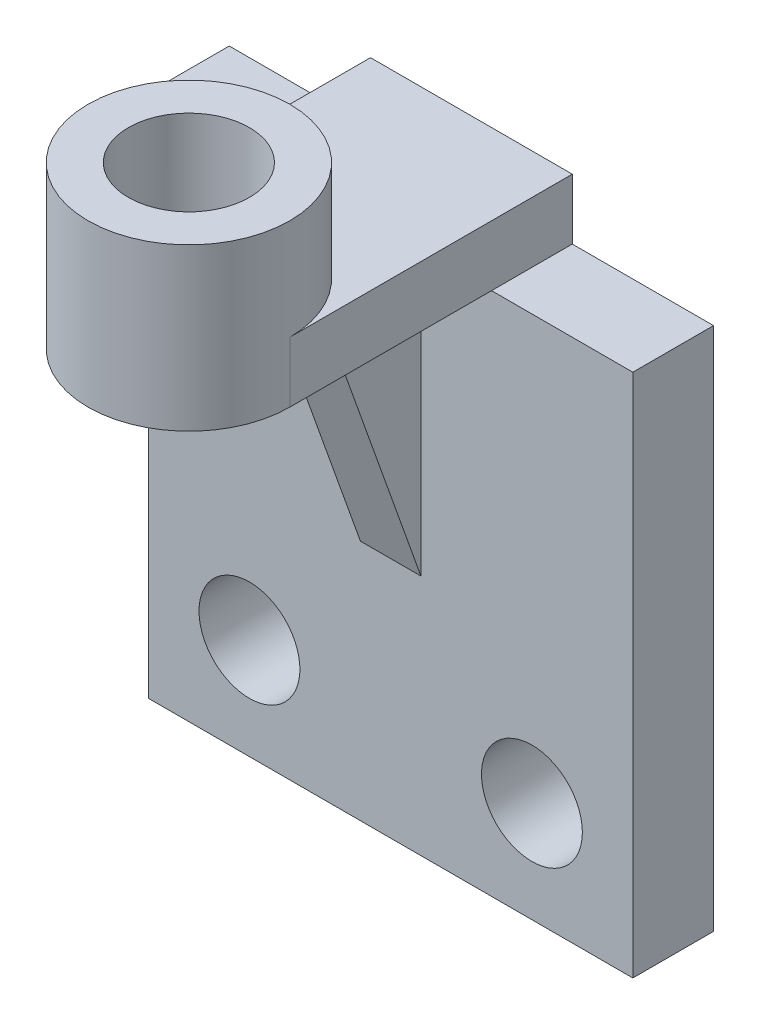
ISO-10303-21;
HEADER;
FILE_DESCRIPTION(('STEP AP214'),'2;1');
FILE_NAME('part.step','',(''),(''),'','','');
FILE_SCHEMA(('AUTOMOTIVE_DESIGN { 1 0 10303 214 1 1 1 1 }'));
ENDSEC;
DATA;
#1=APPLICATION_CONTEXT('core data for automotive mechanical design processes');
#2=APPLICATION_PROTOCOL_DEFINITION('international standard','automotive_design',2000,#1);
#3=PRODUCT_CONTEXT('',#1,'mechanical');
#4=PRODUCT('Part','Part','',(#3));
#5=PRODUCT_RELATED_PRODUCT_CATEGORY('part','',(#4));
#6=PRODUCT_DEFINITION_FORMATION('','',#4);
#7=PRODUCT_DEFINITION_CONTEXT('part definition',#1,'design');
#8=PRODUCT_DEFINITION('design','',#6,#7);
#9=PRODUCT_DEFINITION_SHAPE('','',#8);
#10=(LENGTH_UNIT() NAMED_UNIT(*) SI_UNIT(.MILLI.,.METRE.));
#11=(NAMED_UNIT(*) PLANE_ANGLE_UNIT() SI_UNIT($,.RADIAN.));
#12=(NAMED_UNIT(*) SI_UNIT($,.STERADIAN.) SOLID_ANGLE_UNIT());
#13=UNCERTAINTY_MEASURE_WITH_UNIT(LENGTH_MEASURE(1.E-05),#10,'distance_accuracy_value','');
#14=(GEOMETRIC_REPRESENTATION_CONTEXT(3) GLOBAL_UNCERTAINTY_ASSIGNED_CONTEXT((#13)) GLOBAL_UNIT_ASSIGNED_CONTEXT((#10,
#11,#12)) REPRESENTATION_CONTEXT('',''));
#15=CARTESIAN_POINT('',(0.,0.,0.));
#16=DIRECTION('',(0.,0.,1.));
#17=DIRECTION('',(1.,0.,0.));
#18=AXIS2_PLACEMENT_3D('',#15,#16,#17);
#19=CARTESIAN_POINT('',(-60.,65.,20.));
#20=DIRECTION('',(0.,-1.,0.));
#21=DIRECTION('',(0.,0.,-1.));
#22=AXIS2_PLACEMENT_3D('',#19,#20,#21);
#23=PLANE('',#22);
#24=DIRECTION('',(0.,0.,-1.));
#25=VECTOR('',#24,1.);
#26=CARTESIAN_POINT('',(25.,65.,70.));
#27=LINE('',#26,#25);
#28=CARTESIAN_POINT('',(25.,65.,20.));
#29=VERTEX_POINT('',#28);
#30=CARTESIAN_POINT('',(25.,65.,0.));
#31=VERTEX_POINT('',#30);
#32=EDGE_CURVE('E55',#29,#31,#27,.T.);
#33=ORIENTED_EDGE('',*,*,#32,.F.);
#34=DIRECTION('',(-1.,0.,0.));
#35=VECTOR('',#34,1.);
#36=CARTESIAN_POINT('',(-60.,65.,20.));
#37=LINE('',#36,#35);
#38=CARTESIAN_POINT('',(60.,65.,20.));
#39=VERTEX_POINT('',#38);
#40=EDGE_CURVE('E229',#39,#29,#37,.T.);
#41=ORIENTED_EDGE('',*,*,#40,.F.);
#42=DIRECTION('',(0.,0.,-1.));
#43=VECTOR('',#42,1.);
#44=CARTESIAN_POINT('',(60.,65.,20.));
#45=LINE('',#44,#43);
#46=CARTESIAN_POINT('',(60.,65.,0.));
#47=VERTEX_POINT('',#46);
#48=EDGE_CURVE('E190',#39,#47,#45,.T.);
#49=ORIENTED_EDGE('',*,*,#48,.T.);
#50=DIRECTION('',(-1.,0.,0.));
#51=VECTOR('',#50,1.);
#52=CARTESIAN_POINT('',(-60.,65.,0.));
#53=LINE('',#52,#51);
#54=EDGE_CURVE('E244',#47,#31,#53,.T.);
#55=ORIENTED_EDGE('',*,*,#54,.T.);
#56=EDGE_LOOP('',(#33,#41,#49,#55));
#57=FACE_BOUND('',#56,.T.);
#58=ADVANCED_FACE('F47',(#57),#23,.F.);
#59=DIRECTION('',(0.,0.,1.));
#60=VECTOR('',#59,1.);
#61=CARTESIAN_POINT('',(-25.,65.,70.));
#62=LINE('',#61,#60);
#63=CARTESIAN_POINT('',(-25.,65.,0.));
#64=VERTEX_POINT('',#63);
#65=CARTESIAN_POINT('',(-25.,65.,20.));
#66=VERTEX_POINT('',#65);
#67=EDGE_CURVE('E175',#64,#66,#62,.T.);
#68=ORIENTED_EDGE('',*,*,#67,.F.);
#69=CARTESIAN_POINT('',(-60.,65.,0.));
#70=VERTEX_POINT('',#69);
#71=EDGE_CURVE('E191',#64,#70,#53,.T.);
#72=ORIENTED_EDGE('',*,*,#71,.T.);
#73=DIRECTION('',(0.,0.,-1.));
#74=VECTOR('',#73,1.);
#75=CARTESIAN_POINT('',(-60.,65.,20.));
#76=LINE('',#75,#74);
#77=CARTESIAN_POINT('',(-60.,65.,20.));
#78=VERTEX_POINT('',#77);
#79=EDGE_CURVE('E248',#78,#70,#76,.T.);
#80=ORIENTED_EDGE('',*,*,#79,.F.);
#81=EDGE_CURVE('E227',#66,#78,#37,.T.);
#82=ORIENTED_EDGE('',*,*,#81,.F.);
#83=EDGE_LOOP('',(#68,#72,#80,#82));
#84=FACE_BOUND('',#83,.T.);
#85=ADVANCED_FACE('F278',(#84),#23,.F.);
#86=CARTESIAN_POINT('',(0.,0.,20.));
#87=DIRECTION('',(0.,0.,-1.));
#88=DIRECTION('',(-1.,0.,0.));
#89=AXIS2_PLACEMENT_3D('',#86,#87,#88);
#90=PLANE('',#89);
#91=CARTESIAN_POINT('',(7.5,65.,20.));
#92=VERTEX_POINT('',#91);
#93=EDGE_CURVE('E232',#29,#92,#37,.T.);
#94=ORIENTED_EDGE('',*,*,#93,.T.);
#95=DIRECTION('',(0.,-1.,0.));
#96=VECTOR('',#95,1.);
#97=CARTESIAN_POINT('',(7.5,0.,20.));
#98=LINE('',#97,#96);
#99=CARTESIAN_POINT('',(7.5,-4.99999999999998,20.));
#100=VERTEX_POINT('',#99);
#101=EDGE_CURVE('E154',#92,#100,#98,.T.);
#102=ORIENTED_EDGE('',*,*,#101,.T.);
#103=DIRECTION('',(-1.,0.,0.));
#104=VECTOR('',#103,1.);
#105=CARTESIAN_POINT('',(0.,-5.00000000000002,20.));
#106=LINE('',#105,#104);
#107=CARTESIAN_POINT('',(-7.5,-4.99999999999998,20.));
#108=VERTEX_POINT('',#107);
#109=EDGE_CURVE('E144',#100,#108,#106,.T.);
#110=ORIENTED_EDGE('',*,*,#109,.T.);
#111=DIRECTION('',(0.,-1.,0.));
#112=VECTOR('',#111,1.);
#113=CARTESIAN_POINT('',(-7.5,0.,20.));
#114=LINE('',#113,#112);
#115=CARTESIAN_POINT('',(-7.5,65.,20.));
#116=VERTEX_POINT('',#115);
#117=EDGE_CURVE('E132',#116,#108,#114,.T.);
#118=ORIENTED_EDGE('',*,*,#117,.F.);
#119=EDGE_CURVE('E233',#116,#66,#37,.T.);
#120=ORIENTED_EDGE('',*,*,#119,.T.);
#121=ORIENTED_EDGE('',*,*,#81,.T.);
#122=DIRECTION('',(0.,-1.,0.));
#123=VECTOR('',#122,1.);
#124=CARTESIAN_POINT('',(-60.,-65.,20.));
#125=LINE('',#124,#123);
#126=CARTESIAN_POINT('',(-60.,-65.,20.));
#127=VERTEX_POINT('',#126);
#128=EDGE_CURVE('E231',#78,#127,#125,.T.);
#129=ORIENTED_EDGE('',*,*,#128,.T.);
#130=DIRECTION('',(1.,0.,0.));
#131=VECTOR('',#130,1.);
#132=CARTESIAN_POINT('',(-60.,-65.,20.));
#133=LINE('',#132,#131);
#134=CARTESIAN_POINT('',(60.,-65.,20.));
#135=VERTEX_POINT('',#134);
#136=EDGE_CURVE('E235',#127,#135,#133,.T.);
#137=ORIENTED_EDGE('',*,*,#136,.T.);
#138=DIRECTION('',(0.,1.,0.));
#139=VECTOR('',#138,1.);
#140=CARTESIAN_POINT('',(60.,-65.,20.));
#141=LINE('',#140,#139);
#142=EDGE_CURVE('E224',#135,#39,#141,.T.);
#143=ORIENTED_EDGE('',*,*,#142,.T.);
#144=ORIENTED_EDGE('',*,*,#40,.T.);
#145=EDGE_LOOP('',(#94,#102,#110,#118,#120,#121,#129,#137,#143,#144));
#146=FACE_BOUND('',#145,.T.);
#147=CARTESIAN_POINT('',(35.,-40.,20.));
#148=DIRECTION('',(0.,0.,1.));
#149=DIRECTION('',(1.,0.,0.));
#150=AXIS2_PLACEMENT_3D('',#147,#148,#149);
#151=CIRCLE('',#150,12.5);
#152=CARTESIAN_POINT('',(47.5,-40.,20.));
#153=VERTEX_POINT('',#152);
#154=EDGE_CURVE('E214',#153,#153,#151,.T.);
#155=ORIENTED_EDGE('',*,*,#154,.F.);
#156=EDGE_LOOP('',(#155));
#157=FACE_BOUND('',#156,.T.);
#158=CARTESIAN_POINT('',(-35.,-40.,20.));
#159=DIRECTION('',(0.,0.,-1.));
#160=DIRECTION('',(-1.,0.,0.));
#161=AXIS2_PLACEMENT_3D('',#158,#159,#160);
#162=CIRCLE('',#161,12.5);
#163=CARTESIAN_POINT('',(-47.5,-40.,20.));
#164=VERTEX_POINT('',#163);
#165=EDGE_CURVE('E204',#164,#164,#162,.T.);
#166=ORIENTED_EDGE('',*,*,#165,.T.);
#167=EDGE_LOOP('',(#166));
#168=FACE_BOUND('',#167,.T.);
#169=ADVANCED_FACE('F152',(#146,#157,#168),#90,.F.);
#170=CARTESIAN_POINT('',(0.,0.,0.));
#171=DIRECTION('',(0.,0.,-1.));
#172=DIRECTION('',(-1.,0.,0.));
#173=AXIS2_PLACEMENT_3D('',#170,#171,#172);
#174=PLANE('',#173);
#175=DIRECTION('',(0.,-1.,0.));
#176=VECTOR('',#175,1.);
#177=CARTESIAN_POINT('',(-25.,80.,0.));
#178=LINE('',#177,#176);
#179=CARTESIAN_POINT('',(-25.,80.,0.));
#180=VERTEX_POINT('',#179);
#181=EDGE_CURVE('E196',#180,#64,#178,.T.);
#182=ORIENTED_EDGE('',*,*,#181,.F.);
#183=DIRECTION('',(-1.,0.,0.));
#184=VECTOR('',#183,1.);
#185=CARTESIAN_POINT('',(-25.,80.,0.));
#186=LINE('',#185,#184);
#187=CARTESIAN_POINT('',(25.,80.,0.));
#188=VERTEX_POINT('',#187);
#189=EDGE_CURVE('E174',#188,#180,#186,.T.);
#190=ORIENTED_EDGE('',*,*,#189,.F.);
#191=DIRECTION('',(0.,-1.,0.));
#192=VECTOR('',#191,1.);
#193=CARTESIAN_POINT('',(25.,80.,0.));
#194=LINE('',#193,#192);
#195=EDGE_CURVE('E199',#188,#31,#194,.T.);
#196=ORIENTED_EDGE('',*,*,#195,.T.);
#197=ORIENTED_EDGE('',*,*,#54,.F.);
#198=DIRECTION('',(0.,1.,0.));
#199=VECTOR('',#198,1.);
#200=CARTESIAN_POINT('',(60.,-65.,0.));
#201=LINE('',#200,#199);
#202=CARTESIAN_POINT('',(60.,-65.,0.));
#203=VERTEX_POINT('',#202);
#204=EDGE_CURVE('E221',#203,#47,#201,.T.);
#205=ORIENTED_EDGE('',*,*,#204,.F.);
#206=DIRECTION('',(1.,0.,0.));
#207=VECTOR('',#206,1.);
#208=CARTESIAN_POINT('',(-60.,-65.,0.));
#209=LINE('',#208,#207);
#210=CARTESIAN_POINT('',(-60.,-65.,0.));
#211=VERTEX_POINT('',#210);
#212=EDGE_CURVE('E228',#211,#203,#209,.T.);
#213=ORIENTED_EDGE('',*,*,#212,.F.);
#214=DIRECTION('',(0.,-1.,0.));
#215=VECTOR('',#214,1.);
#216=CARTESIAN_POINT('',(-60.,-65.,0.));
#217=LINE('',#216,#215);
#218=EDGE_CURVE('E241',#70,#211,#217,.T.);
#219=ORIENTED_EDGE('',*,*,#218,.F.);
#220=ORIENTED_EDGE('',*,*,#71,.F.);
#221=EDGE_LOOP('',(#182,#190,#196,#197,#205,#213,#219,#220));
#222=FACE_BOUND('',#221,.T.);
#223=CARTESIAN_POINT('',(35.,-40.,0.));
#224=DIRECTION('',(0.,0.,1.));
#225=DIRECTION('',(1.,0.,0.));
#226=AXIS2_PLACEMENT_3D('',#223,#224,#225);
#227=CIRCLE('',#226,12.5);
#228=CARTESIAN_POINT('',(47.5,-40.,0.));
#229=VERTEX_POINT('',#228);
#230=EDGE_CURVE('E218',#229,#229,#227,.T.);
#231=ORIENTED_EDGE('',*,*,#230,.T.);
#232=EDGE_LOOP('',(#231));
#233=FACE_BOUND('',#232,.T.);
#234=CARTESIAN_POINT('',(-35.,-40.,0.));
#235=DIRECTION('',(0.,0.,-1.));
#236=DIRECTION('',(-1.,0.,0.));
#237=AXIS2_PLACEMENT_3D('',#234,#235,#236);
#238=CIRCLE('',#237,12.5);
#239=CARTESIAN_POINT('',(-47.5,-40.,0.));
#240=VERTEX_POINT('',#239);
#241=EDGE_CURVE('E209',#240,#240,#238,.T.);
#242=ORIENTED_EDGE('',*,*,#241,.F.);
#243=EDGE_LOOP('',(#242));
#244=FACE_BOUND('',#243,.T.);
#245=ADVANCED_FACE('F269',(#222,#233,#244),#174,.T.);
#246=CARTESIAN_POINT('',(60.,-65.,20.));
#247=DIRECTION('',(-1.,0.,0.));
#248=DIRECTION('',(0.,0.,1.));
#249=AXIS2_PLACEMENT_3D('',#246,#247,#248);
#250=PLANE('',#249);
#251=ORIENTED_EDGE('',*,*,#204,.T.);
#252=ORIENTED_EDGE('',*,*,#48,.F.);
#253=ORIENTED_EDGE('',*,*,#142,.F.);
#254=DIRECTION('',(0.,0.,-1.));
#255=VECTOR('',#254,1.);
#256=CARTESIAN_POINT('',(60.,-65.,20.));
#257=LINE('',#256,#255);
#258=EDGE_CURVE('E237',#135,#203,#257,.T.);
#259=ORIENTED_EDGE('',*,*,#258,.T.);
#260=EDGE_LOOP('',(#251,#252,#253,#259));
#261=FACE_BOUND('',#260,.T.);
#262=ADVANCED_FACE('F49',(#261),#250,.F.);
#263=CARTESIAN_POINT('',(-60.,-65.,20.));
#264=DIRECTION('',(1.,0.,0.));
#265=DIRECTION('',(0.,0.,-1.));
#266=AXIS2_PLACEMENT_3D('',#263,#264,#265);
#267=PLANE('',#266);
#268=ORIENTED_EDGE('',*,*,#218,.T.);
#269=DIRECTION('',(0.,0.,-1.));
#270=VECTOR('',#269,1.);
#271=CARTESIAN_POINT('',(-60.,-65.,20.));
#272=LINE('',#271,#270);
#273=EDGE_CURVE('E251',#127,#211,#272,.T.);
#274=ORIENTED_EDGE('',*,*,#273,.F.);
#275=ORIENTED_EDGE('',*,*,#128,.F.);
#276=ORIENTED_EDGE('',*,*,#79,.T.);
#277=EDGE_LOOP('',(#268,#274,#275,#276));
#278=FACE_BOUND('',#277,.T.);
#279=ADVANCED_FACE('F261',(#278),#267,.F.);
#280=CARTESIAN_POINT('',(-60.,-65.,20.));
#281=DIRECTION('',(0.,1.,0.));
#282=DIRECTION('',(0.,0.,1.));
#283=AXIS2_PLACEMENT_3D('',#280,#281,#282);
#284=PLANE('',#283);
#285=ORIENTED_EDGE('',*,*,#212,.T.);
#286=ORIENTED_EDGE('',*,*,#258,.F.);
#287=ORIENTED_EDGE('',*,*,#136,.F.);
#288=ORIENTED_EDGE('',*,*,#273,.T.);
#289=EDGE_LOOP('',(#285,#286,#287,#288));
#290=FACE_BOUND('',#289,.T.);
#291=ADVANCED_FACE('F266',(#290),#284,.F.);
#292=CARTESIAN_POINT('',(35.,-40.,0.));
#293=DIRECTION('',(0.,0.,1.));
#294=DIRECTION('',(1.,0.,0.));
#295=AXIS2_PLACEMENT_3D('',#292,#293,#294);
#296=CYLINDRICAL_SURFACE('',#295,12.5);
#297=ORIENTED_EDGE('',*,*,#230,.F.);
#298=EDGE_LOOP('',(#297));
#299=FACE_BOUND('',#298,.T.);
#300=ORIENTED_EDGE('',*,*,#154,.T.);
#301=EDGE_LOOP('',(#300));
#302=FACE_BOUND('',#301,.T.);
#303=ADVANCED_FACE('F320',(#299,#302),#296,.F.);
#304=CARTESIAN_POINT('',(-35.,-40.,0.));
#305=DIRECTION('',(0.,0.,1.));
#306=DIRECTION('',(1.,0.,0.));
#307=AXIS2_PLACEMENT_3D('',#304,#305,#306);
#308=CYLINDRICAL_SURFACE('',#307,12.5);
#309=ORIENTED_EDGE('',*,*,#241,.T.);
#310=EDGE_LOOP('',(#309));
#311=FACE_BOUND('',#310,.T.);
#312=ORIENTED_EDGE('',*,*,#165,.F.);
#313=EDGE_LOOP('',(#312));
#314=FACE_BOUND('',#313,.T.);
#315=ADVANCED_FACE('F327',(#311,#314),#308,.F.);
#316=CARTESIAN_POINT('',(0.,65.,0.));
#317=DIRECTION('',(0.,-1.,0.));
#318=DIRECTION('',(0.,0.,-1.));
#319=AXIS2_PLACEMENT_3D('',#316,#317,#318);
#320=PLANE('',#319);
#321=DIRECTION('',(0.,0.,1.));
#322=VECTOR('',#321,1.);
#323=CARTESIAN_POINT('',(7.5,65.,0.));
#324=LINE('',#323,#322);
#325=CARTESIAN_POINT('',(7.5,65.,45.));
#326=VERTEX_POINT('',#325);
#327=EDGE_CURVE('E139',#92,#326,#324,.T.);
#328=ORIENTED_EDGE('',*,*,#327,.F.);
#329=ORIENTED_EDGE('',*,*,#93,.F.);
#330=CARTESIAN_POINT('',(25.,65.,70.));
#331=VERTEX_POINT('',#330);
#332=EDGE_CURVE('E170',#331,#29,#27,.T.);
#333=ORIENTED_EDGE('',*,*,#332,.F.);
#334=CARTESIAN_POINT('',(0.,65.,70.));
#335=DIRECTION('',(0.,-1.,0.));
#336=DIRECTION('',(0.,0.,-1.));
#337=AXIS2_PLACEMENT_3D('',#334,#335,#336);
#338=CIRCLE('',#337,25.);
#339=CARTESIAN_POINT('',(-25.,65.,70.));
#340=VERTEX_POINT('',#339);
#341=EDGE_CURVE('E168',#340,#331,#338,.F.);
#342=ORIENTED_EDGE('',*,*,#341,.F.);
#343=EDGE_CURVE('E184',#66,#340,#62,.T.);
#344=ORIENTED_EDGE('',*,*,#343,.F.);
#345=ORIENTED_EDGE('',*,*,#119,.F.);
#346=DIRECTION('',(0.,0.,1.));
#347=VECTOR('',#346,1.);
#348=CARTESIAN_POINT('',(-7.5,65.,0.));
#349=LINE('',#348,#347);
#350=CARTESIAN_POINT('',(-7.5,65.,45.));
#351=VERTEX_POINT('',#350);
#352=EDGE_CURVE('E135',#116,#351,#349,.T.);
#353=ORIENTED_EDGE('',*,*,#352,.T.);
#354=DIRECTION('',(-1.,0.,0.));
#355=VECTOR('',#354,1.);
#356=CARTESIAN_POINT('',(0.,65.,45.));
#357=LINE('',#356,#355);
#358=EDGE_CURVE('E147',#326,#351,#357,.T.);
#359=ORIENTED_EDGE('',*,*,#358,.F.);
#360=EDGE_LOOP('',(#328,#329,#333,#342,#344,#345,#353,#359));
#361=FACE_BOUND('',#360,.T.);
#362=CARTESIAN_POINT('',(0.,65.,70.));
#363=DIRECTION('',(0.,-1.,0.));
#364=DIRECTION('',(0.,0.,-1.));
#365=AXIS2_PLACEMENT_3D('',#362,#363,#364);
#366=CIRCLE('',#365,15.);
#367=CARTESIAN_POINT('',(0.,65.,55.));
#368=VERTEX_POINT('',#367);
#369=EDGE_CURVE('E158',#368,#368,#366,.T.);
#370=ORIENTED_EDGE('',*,*,#369,.F.);
#371=EDGE_LOOP('',(#370));
#372=FACE_BOUND('',#371,.T.);
#373=ADVANCED_FACE('F295',(#361,#372),#320,.T.);
#374=CARTESIAN_POINT('',(25.,80.,70.));
#375=DIRECTION('',(-1.,0.,0.));
#376=DIRECTION('',(0.,0.,1.));
#377=AXIS2_PLACEMENT_3D('',#374,#375,#376);
#378=PLANE('',#377);
#379=ORIENTED_EDGE('',*,*,#332,.T.);
#380=ORIENTED_EDGE('',*,*,#32,.T.);
#381=ORIENTED_EDGE('',*,*,#195,.F.);
#382=DIRECTION('',(0.,0.,-1.));
#383=VECTOR('',#382,1.);
#384=CARTESIAN_POINT('',(25.,80.,70.));
#385=LINE('',#384,#383);
#386=CARTESIAN_POINT('',(25.,80.,70.));
#387=VERTEX_POINT('',#386);
#388=EDGE_CURVE('E171',#387,#188,#385,.T.);
#389=ORIENTED_EDGE('',*,*,#388,.F.);
#390=DIRECTION('',(0.,-1.,0.));
#391=VECTOR('',#390,1.);
#392=CARTESIAN_POINT('',(25.,80.,70.));
#393=LINE('',#392,#391);
#394=EDGE_CURVE('E180',#387,#331,#393,.T.);
#395=ORIENTED_EDGE('',*,*,#394,.T.);
#396=EDGE_LOOP('',(#379,#380,#381,#389,#395));
#397=FACE_BOUND('',#396,.T.);
#398=ADVANCED_FACE('F290',(#397),#378,.F.);
#399=CARTESIAN_POINT('',(-25.,80.,70.));
#400=DIRECTION('',(1.,0.,0.));
#401=DIRECTION('',(0.,0.,-1.));
#402=AXIS2_PLACEMENT_3D('',#399,#400,#401);
#403=PLANE('',#402);
#404=ORIENTED_EDGE('',*,*,#67,.T.);
#405=ORIENTED_EDGE('',*,*,#343,.T.);
#406=DIRECTION('',(0.,-1.,0.));
#407=VECTOR('',#406,1.);
#408=CARTESIAN_POINT('',(-25.,80.,70.));
#409=LINE('',#408,#407);
#410=CARTESIAN_POINT('',(-25.,80.,70.));
#411=VERTEX_POINT('',#410);
#412=EDGE_CURVE('E200',#411,#340,#409,.T.);
#413=ORIENTED_EDGE('',*,*,#412,.F.);
#414=DIRECTION('',(0.,0.,1.));
#415=VECTOR('',#414,1.);
#416=CARTESIAN_POINT('',(-25.,80.,70.));
#417=LINE('',#416,#415);
#418=EDGE_CURVE('E177',#180,#411,#417,.T.);
#419=ORIENTED_EDGE('',*,*,#418,.F.);
#420=ORIENTED_EDGE('',*,*,#181,.T.);
#421=EDGE_LOOP('',(#404,#405,#413,#419,#420));
#422=FACE_BOUND('',#421,.T.);
#423=ADVANCED_FACE('F281',(#422),#403,.F.);
#424=CARTESIAN_POINT('',(0.,80.,0.));
#425=DIRECTION('',(0.,-1.,0.));
#426=DIRECTION('',(0.,0.,-1.));
#427=AXIS2_PLACEMENT_3D('',#424,#425,#426);
#428=PLANE('',#427);
#429=ORIENTED_EDGE('',*,*,#189,.T.);
#430=ORIENTED_EDGE('',*,*,#418,.T.);
#431=CARTESIAN_POINT('',(0.,80.,70.));
#432=DIRECTION('',(0.,-1.,0.));
#433=DIRECTION('',(0.,0.,-1.));
#434=AXIS2_PLACEMENT_3D('',#431,#432,#433);
#435=CIRCLE('',#434,25.);
#436=EDGE_CURVE('E13',#411,#387,#435,.T.);
#437=ORIENTED_EDGE('',*,*,#436,.T.);
#438=ORIENTED_EDGE('',*,*,#388,.T.);
#439=EDGE_LOOP('',(#429,#430,#437,#438));
#440=FACE_BOUND('',#439,.T.);
#441=ADVANCED_FACE('F285',(#440),#428,.F.);
#442=CARTESIAN_POINT('',(0.,-5.71067811865475,70.));
#443=DIRECTION('',(0.,1.,0.));
#444=DIRECTION('',(0.,0.,1.));
#445=AXIS2_PLACEMENT_3D('',#442,#443,#444);
#446=CYLINDRICAL_SURFACE('',#445,25.);
#447=ORIENTED_EDGE('',*,*,#394,.F.);
#448=ORIENTED_EDGE('',*,*,#436,.F.);
#449=ORIENTED_EDGE('',*,*,#412,.T.);
#450=ORIENTED_EDGE('',*,*,#341,.T.);
#451=EDGE_LOOP('',(#447,#448,#449,#450));
#452=FACE_BOUND('',#451,.T.);
#453=CARTESIAN_POINT('',(0.,105.,70.));
#454=DIRECTION('',(0.,1.,0.));
#455=DIRECTION('',(0.,0.,1.));
#456=AXIS2_PLACEMENT_3D('',#453,#454,#455);
#457=CIRCLE('',#456,25.);
#458=CARTESIAN_POINT('',(0.,105.,95.));
#459=VERTEX_POINT('',#458);
#460=EDGE_CURVE('E165',#459,#459,#457,.T.);
#461=ORIENTED_EDGE('',*,*,#460,.F.);
#462=EDGE_LOOP('',(#461));
#463=FACE_BOUND('',#462,.T.);
#464=ADVANCED_FACE('F340',(#452,#463),#446,.T.);
#465=CARTESIAN_POINT('',(0.,105.,70.));
#466=DIRECTION('',(0.,1.,0.));
#467=DIRECTION('',(0.,0.,1.));
#468=AXIS2_PLACEMENT_3D('',#465,#466,#467);
#469=PLANE('',#468);
#470=ORIENTED_EDGE('',*,*,#460,.T.);
#471=EDGE_LOOP('',(#470));
#472=FACE_BOUND('',#471,.T.);
#473=CARTESIAN_POINT('',(0.,105.,70.));
#474=DIRECTION('',(0.,1.,0.));
#475=DIRECTION('',(0.,0.,1.));
#476=AXIS2_PLACEMENT_3D('',#473,#474,#475);
#477=CIRCLE('',#476,15.);
#478=CARTESIAN_POINT('',(0.,105.,85.));
#479=VERTEX_POINT('',#478);
#480=EDGE_CURVE('E155',#479,#479,#477,.T.);
#481=ORIENTED_EDGE('',*,*,#480,.F.);
#482=EDGE_LOOP('',(#481));
#483=FACE_BOUND('',#482,.T.);
#484=ADVANCED_FACE('F343',(#472,#483),#469,.T.);
#485=CARTESIAN_POINT('',(0.,-65.,70.));
#486=DIRECTION('',(0.,1.,0.));
#487=DIRECTION('',(0.,0.,1.));
#488=AXIS2_PLACEMENT_3D('',#485,#486,#487);
#489=CYLINDRICAL_SURFACE('',#488,15.);
#490=ORIENTED_EDGE('',*,*,#369,.T.);
#491=EDGE_LOOP('',(#490));
#492=FACE_BOUND('',#491,.T.);
#493=ORIENTED_EDGE('',*,*,#480,.T.);
#494=EDGE_LOOP('',(#493));
#495=FACE_BOUND('',#494,.T.);
#496=ADVANCED_FACE('F309',(#492,#495),#489,.F.);
#497=CARTESIAN_POINT('',(0.,65.,45.));
#498=DIRECTION('',(0.,-0.336336396998156,0.941741911594838));
#499=DIRECTION('',(0.,-0.941741911594838,-0.336336396998156));
#500=AXIS2_PLACEMENT_3D('',#497,#498,#499);
#501=PLANE('',#500);
#502=ORIENTED_EDGE('',*,*,#109,.F.);
#503=DIRECTION('',(0.,-0.941741911594838,-0.336336396998156));
#504=VECTOR('',#503,1.);
#505=CARTESIAN_POINT('',(7.5,65.,45.));
#506=LINE('',#505,#504);
#507=EDGE_CURVE('E148',#326,#100,#506,.T.);
#508=ORIENTED_EDGE('',*,*,#507,.F.);
#509=ORIENTED_EDGE('',*,*,#358,.T.);
#510=DIRECTION('',(0.,-0.941741911594838,-0.336336396998156));
#511=VECTOR('',#510,1.);
#512=CARTESIAN_POINT('',(-7.5,65.,45.));
#513=LINE('',#512,#511);
#514=EDGE_CURVE('E62',#351,#108,#513,.T.);
#515=ORIENTED_EDGE('',*,*,#514,.T.);
#516=EDGE_LOOP('',(#502,#508,#509,#515));
#517=FACE_BOUND('',#516,.T.);
#518=ADVANCED_FACE('F142',(#517),#501,.T.);
#519=CARTESIAN_POINT('',(7.5,20.,47.499975));
#520=DIRECTION('',(1.,0.,0.));
#521=DIRECTION('',(0.,0.,-1.));
#522=AXIS2_PLACEMENT_3D('',#519,#520,#521);
#523=PLANE('',#522);
#524=ORIENTED_EDGE('',*,*,#101,.F.);
#525=ORIENTED_EDGE('',*,*,#327,.T.);
#526=ORIENTED_EDGE('',*,*,#507,.T.);
#527=EDGE_LOOP('',(#524,#525,#526));
#528=FACE_BOUND('',#527,.T.);
#529=ADVANCED_FACE('F301',(#528),#523,.T.);
#530=CARTESIAN_POINT('',(-7.5,20.,47.499975));
#531=DIRECTION('',(1.,0.,0.));
#532=DIRECTION('',(0.,0.,-1.));
#533=AXIS2_PLACEMENT_3D('',#530,#531,#532);
#534=PLANE('',#533);
#535=ORIENTED_EDGE('',*,*,#352,.F.);
#536=ORIENTED_EDGE('',*,*,#117,.T.);
#537=ORIENTED_EDGE('',*,*,#514,.F.);
#538=EDGE_LOOP('',(#535,#536,#537));
#539=FACE_BOUND('',#538,.T.);
#540=ADVANCED_FACE('F133',(#539),#534,.F.);
#541=CLOSED_SHELL('',(#58,#85,#169,#245,#262,#279,#291,#303,#315,#373,#398,#423,#441,#464,#484,
#496,#518,#529,#540));
#542=MANIFOLD_SOLID_BREP('B2',#541);
#543=ADVANCED_BREP_SHAPE_REPRESENTATION('',(#18,#542),#14);
#544=SHAPE_DEFINITION_REPRESENTATION(#9,#543);
ENDSEC;
END-ISO-10303-21;
